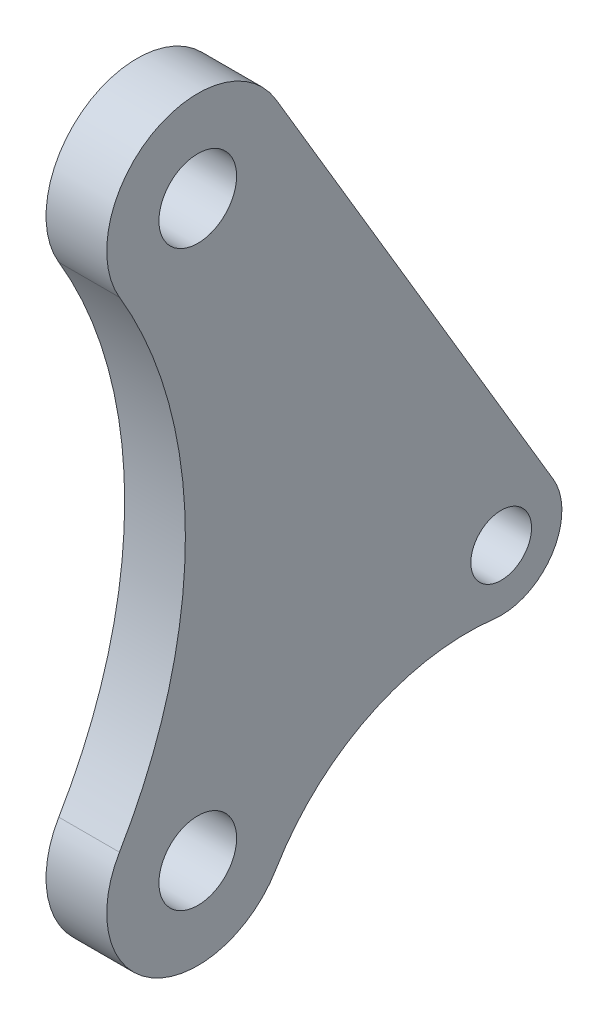
ISO-10303-21;
HEADER;
FILE_DESCRIPTION(('STEP AP214'),'2;1');
FILE_NAME('part.step','',(''),(''),'','','');
FILE_SCHEMA(('AUTOMOTIVE_DESIGN { 1 0 10303 214 1 1 1 1 }'));
ENDSEC;
DATA;
#1=APPLICATION_CONTEXT('core data for automotive mechanical design processes');
#2=APPLICATION_PROTOCOL_DEFINITION('international standard','automotive_design',2000,#1);
#3=PRODUCT_CONTEXT('',#1,'mechanical');
#4=PRODUCT('Part','Part','',(#3));
#5=PRODUCT_RELATED_PRODUCT_CATEGORY('part','',(#4));
#6=PRODUCT_DEFINITION_FORMATION('','',#4);
#7=PRODUCT_DEFINITION_CONTEXT('part definition',#1,'design');
#8=PRODUCT_DEFINITION('design','',#6,#7);
#9=PRODUCT_DEFINITION_SHAPE('','',#8);
#10=(LENGTH_UNIT() NAMED_UNIT(*) SI_UNIT(.MILLI.,.METRE.));
#11=(NAMED_UNIT(*) PLANE_ANGLE_UNIT() SI_UNIT($,.RADIAN.));
#12=(NAMED_UNIT(*) SI_UNIT($,.STERADIAN.) SOLID_ANGLE_UNIT());
#13=UNCERTAINTY_MEASURE_WITH_UNIT(LENGTH_MEASURE(1.E-05),#10,'distance_accuracy_value','');
#14=(GEOMETRIC_REPRESENTATION_CONTEXT(3) GLOBAL_UNCERTAINTY_ASSIGNED_CONTEXT((#13)) GLOBAL_UNIT_ASSIGNED_CONTEXT((#10,
#11,#12)) REPRESENTATION_CONTEXT('',''));
#15=CARTESIAN_POINT('',(0.,0.,0.));
#16=DIRECTION('',(0.,0.,1.));
#17=DIRECTION('',(1.,0.,0.));
#18=AXIS2_PLACEMENT_3D('',#15,#16,#17);
#19=CARTESIAN_POINT('',(3.175,-8.37624187138733,-14.1204117999572));
#20=DIRECTION('',(-1.,0.,0.));
#21=DIRECTION('',(0.,0.,1.));
#22=AXIS2_PLACEMENT_3D('',#19,#20,#21);
#23=CYLINDRICAL_SURFACE('',#22,11.6554005140229);
#24=CARTESIAN_POINT('',(0.,-8.37624187138733,-14.1204117999572));
#25=DIRECTION('',(-1.,0.,0.));
#26=DIRECTION('',(0.,0.,-1.));
#27=AXIS2_PLACEMENT_3D('',#24,#25,#26);
#28=CIRCLE('',#27,11.6554005140229);
#29=CARTESIAN_POINT('',(0.,-2.42977790481856,-4.09604511489504));
#30=VERTEX_POINT('',#29);
#31=CARTESIAN_POINT('',(0.,3.19729903973633,-15.4993649974343));
#32=VERTEX_POINT('',#31);
#33=EDGE_CURVE('E148',#30,#32,#28,.T.);
#34=ORIENTED_EDGE('',*,*,#33,.T.);
#35=DIRECTION('',(-1.,0.,0.));
#36=VECTOR('',#35,1.);
#37=CARTESIAN_POINT('',(3.175,3.19729903973633,-15.4993649974343));
#38=LINE('',#37,#36);
#39=CARTESIAN_POINT('',(3.175,3.19729903973633,-15.4993649974343));
#40=VERTEX_POINT('',#39);
#41=EDGE_CURVE('E11',#40,#32,#38,.T.);
#42=ORIENTED_EDGE('',*,*,#41,.F.);
#43=CARTESIAN_POINT('',(3.175,-8.37624187138733,-14.1204117999572));
#44=DIRECTION('',(-1.,0.,0.));
#45=DIRECTION('',(0.,0.,-1.));
#46=AXIS2_PLACEMENT_3D('',#43,#44,#45);
#47=CIRCLE('',#46,11.6554005140229);
#48=CARTESIAN_POINT('',(3.175,-2.42977790481856,-4.09604511489504));
#49=VERTEX_POINT('',#48);
#50=EDGE_CURVE('E165',#49,#40,#47,.T.);
#51=ORIENTED_EDGE('',*,*,#50,.F.);
#52=DIRECTION('',(-1.,0.,0.));
#53=VECTOR('',#52,1.);
#54=CARTESIAN_POINT('',(3.175,-2.42977790481856,-4.09604511489504));
#55=LINE('',#54,#53);
#56=EDGE_CURVE('E144',#49,#30,#55,.T.);
#57=ORIENTED_EDGE('',*,*,#56,.T.);
#58=EDGE_LOOP('',(#34,#42,#51,#57));
#59=FACE_BOUND('',#58,.T.);
#60=ADVANCED_FACE('F45',(#59),#23,.F.);
#61=CARTESIAN_POINT('',(3.175,6.35,-15.875));
#62=DIRECTION('',(-1.,0.,0.));
#63=DIRECTION('',(0.,0.,1.));
#64=AXIS2_PLACEMENT_3D('',#61,#62,#63);
#65=CYLINDRICAL_SURFACE('',#64,3.175);
#66=CARTESIAN_POINT('',(0.,6.35,-15.875));
#67=DIRECTION('',(1.,0.,0.));
#68=DIRECTION('',(0.,0.,1.));
#69=AXIS2_PLACEMENT_3D('',#66,#67,#68);
#70=CIRCLE('',#69,3.175);
#71=CARTESIAN_POINT('',(0.,7.96985193654571,-18.6056967432634));
#72=VERTEX_POINT('',#71);
#73=EDGE_CURVE('E152',#32,#72,#70,.T.);
#74=ORIENTED_EDGE('',*,*,#73,.T.);
#75=DIRECTION('',(-1.,0.,0.));
#76=VECTOR('',#75,1.);
#77=CARTESIAN_POINT('',(3.175,7.96985193654571,-18.6056967432634));
#78=LINE('',#77,#76);
#79=CARTESIAN_POINT('',(3.175,7.96985193654571,-18.6056967432634));
#80=VERTEX_POINT('',#79);
#81=EDGE_CURVE('E54',#80,#72,#78,.T.);
#82=ORIENTED_EDGE('',*,*,#81,.F.);
#83=CARTESIAN_POINT('',(3.175,6.35,-15.875));
#84=DIRECTION('',(1.,0.,0.));
#85=DIRECTION('',(0.,0.,1.));
#86=AXIS2_PLACEMENT_3D('',#83,#84,#85);
#87=CIRCLE('',#86,3.175);
#88=EDGE_CURVE('E109',#40,#80,#87,.T.);
#89=ORIENTED_EDGE('',*,*,#88,.F.);
#90=ORIENTED_EDGE('',*,*,#41,.T.);
#91=EDGE_LOOP('',(#74,#82,#89,#90));
#92=FACE_BOUND('',#91,.T.);
#93=ADVANCED_FACE('F195',(#92),#65,.T.);
#94=CARTESIAN_POINT('',(3.175,32.4297779048186,-4.09604511489505));
#95=DIRECTION('',(0.,-0.510189586313607,0.860061966382161));
#96=DIRECTION('',(0.,-0.860061966382161,-0.510189586313607));
#97=AXIS2_PLACEMENT_3D('',#94,#95,#96);
#98=PLANE('',#97);
#99=DIRECTION('',(0.,0.860061966382161,0.510189586313607));
#100=VECTOR('',#99,1.);
#101=CARTESIAN_POINT('',(0.,32.4297779048186,-4.09604511489505));
#102=LINE('',#101,#100);
#103=CARTESIAN_POINT('',(0.,32.4297779048186,-4.09604511489504));
#104=VERTEX_POINT('',#103);
#105=EDGE_CURVE('E156',#72,#104,#102,.T.);
#106=ORIENTED_EDGE('',*,*,#105,.T.);
#107=DIRECTION('',(-1.,0.,0.));
#108=VECTOR('',#107,1.);
#109=CARTESIAN_POINT('',(3.175,32.4297779048186,-4.09604511489504));
#110=LINE('',#109,#108);
#111=CARTESIAN_POINT('',(3.175,32.4297779048186,-4.09604511489504));
#112=VERTEX_POINT('',#111);
#113=EDGE_CURVE('E135',#112,#104,#110,.T.);
#114=ORIENTED_EDGE('',*,*,#113,.F.);
#115=DIRECTION('',(0.,0.860061966382161,0.510189586313607));
#116=VECTOR('',#115,1.);
#117=CARTESIAN_POINT('',(3.175,32.4297779048186,-4.09604511489505));
#118=LINE('',#117,#116);
#119=EDGE_CURVE('E124',#80,#112,#118,.T.);
#120=ORIENTED_EDGE('',*,*,#119,.F.);
#121=ORIENTED_EDGE('',*,*,#81,.T.);
#122=EDGE_LOOP('',(#106,#114,#120,#121));
#123=FACE_BOUND('',#122,.T.);
#124=ADVANCED_FACE('F176',(#123),#98,.F.);
#125=CARTESIAN_POINT('',(3.175,30.,0.));
#126=DIRECTION('',(-1.,0.,0.));
#127=DIRECTION('',(0.,0.,1.));
#128=AXIS2_PLACEMENT_3D('',#125,#126,#127);
#129=CYLINDRICAL_SURFACE('',#128,4.7625);
#130=CARTESIAN_POINT('',(0.,30.,0.));
#131=DIRECTION('',(1.,0.,0.));
#132=DIRECTION('',(0.,0.,1.));
#133=AXIS2_PLACEMENT_3D('',#130,#131,#132);
#134=CIRCLE('',#133,4.7625);
#135=CARTESIAN_POINT('',(0.,27.5702220951814,4.09604511489504));
#136=VERTEX_POINT('',#135);
#137=EDGE_CURVE('E133',#104,#136,#134,.T.);
#138=ORIENTED_EDGE('',*,*,#137,.T.);
#139=DIRECTION('',(-1.,0.,0.));
#140=VECTOR('',#139,1.);
#141=CARTESIAN_POINT('',(3.175,27.5702220951814,4.09604511489504));
#142=LINE('',#141,#140);
#143=CARTESIAN_POINT('',(3.175,27.5702220951814,4.09604511489504));
#144=VERTEX_POINT('',#143);
#145=EDGE_CURVE('E130',#144,#136,#142,.T.);
#146=ORIENTED_EDGE('',*,*,#145,.F.);
#147=CARTESIAN_POINT('',(3.175,30.,0.));
#148=DIRECTION('',(1.,0.,0.));
#149=DIRECTION('',(0.,0.,1.));
#150=AXIS2_PLACEMENT_3D('',#147,#148,#149);
#151=CIRCLE('',#150,4.7625);
#152=EDGE_CURVE('E118',#112,#144,#151,.T.);
#153=ORIENTED_EDGE('',*,*,#152,.F.);
#154=ORIENTED_EDGE('',*,*,#113,.T.);
#155=EDGE_LOOP('',(#138,#146,#153,#154));
#156=FACE_BOUND('',#155,.T.);
#157=ADVANCED_FACE('F131',(#156),#129,.T.);
#158=CARTESIAN_POINT('',(3.175,15.,25.2865402231129));
#159=DIRECTION('',(-1.,0.,0.));
#160=DIRECTION('',(0.,0.,1.));
#161=AXIS2_PLACEMENT_3D('',#158,#159,#160);
#162=CYLINDRICAL_SURFACE('',#161,24.6383353019962);
#163=CARTESIAN_POINT('',(0.,15.,25.2865402231129));
#164=DIRECTION('',(-1.,0.,0.));
#165=DIRECTION('',(0.,0.,1.));
#166=AXIS2_PLACEMENT_3D('',#163,#164,#165);
#167=CIRCLE('',#166,24.6383353019962);
#168=CARTESIAN_POINT('',(0.,2.42977790481856,4.09604511489504));
#169=VERTEX_POINT('',#168);
#170=EDGE_CURVE('E93',#136,#169,#167,.T.);
#171=ORIENTED_EDGE('',*,*,#170,.T.);
#172=DIRECTION('',(-1.,0.,0.));
#173=VECTOR('',#172,1.);
#174=CARTESIAN_POINT('',(3.175,2.42977790481856,4.09604511489504));
#175=LINE('',#174,#173);
#176=CARTESIAN_POINT('',(3.175,2.42977790481856,4.09604511489504));
#177=VERTEX_POINT('',#176);
#178=EDGE_CURVE('E136',#177,#169,#175,.T.);
#179=ORIENTED_EDGE('',*,*,#178,.F.);
#180=CARTESIAN_POINT('',(3.175,15.,25.2865402231129));
#181=DIRECTION('',(-1.,0.,0.));
#182=DIRECTION('',(0.,0.,1.));
#183=AXIS2_PLACEMENT_3D('',#180,#181,#182);
#184=CIRCLE('',#183,24.6383353019962);
#185=EDGE_CURVE('E122',#144,#177,#184,.T.);
#186=ORIENTED_EDGE('',*,*,#185,.F.);
#187=ORIENTED_EDGE('',*,*,#145,.T.);
#188=EDGE_LOOP('',(#171,#179,#186,#187));
#189=FACE_BOUND('',#188,.T.);
#190=ADVANCED_FACE('F138',(#189),#162,.F.);
#191=CARTESIAN_POINT('',(3.175,0.,0.));
#192=DIRECTION('',(-1.,0.,0.));
#193=DIRECTION('',(0.,0.,1.));
#194=AXIS2_PLACEMENT_3D('',#191,#192,#193);
#195=CYLINDRICAL_SURFACE('',#194,4.7625);
#196=CARTESIAN_POINT('',(0.,0.,0.));
#197=DIRECTION('',(1.,0.,0.));
#198=DIRECTION('',(0.,0.,1.));
#199=AXIS2_PLACEMENT_3D('',#196,#197,#198);
#200=CIRCLE('',#199,4.7625);
#201=EDGE_CURVE('E99',#169,#30,#200,.T.);
#202=ORIENTED_EDGE('',*,*,#201,.T.);
#203=ORIENTED_EDGE('',*,*,#56,.F.);
#204=CARTESIAN_POINT('',(3.175,0.,0.));
#205=DIRECTION('',(1.,0.,0.));
#206=DIRECTION('',(0.,0.,1.));
#207=AXIS2_PLACEMENT_3D('',#204,#205,#206);
#208=CIRCLE('',#207,4.7625);
#209=EDGE_CURVE('E65',#177,#49,#208,.T.);
#210=ORIENTED_EDGE('',*,*,#209,.F.);
#211=ORIENTED_EDGE('',*,*,#178,.T.);
#212=EDGE_LOOP('',(#202,#203,#210,#211));
#213=FACE_BOUND('',#212,.T.);
#214=ADVANCED_FACE('F183',(#213),#195,.T.);
#215=CARTESIAN_POINT('',(3.175,-8.37624187138733,-14.1204117999572));
#216=DIRECTION('',(1.,0.,0.));
#217=DIRECTION('',(0.,0.,-1.));
#218=AXIS2_PLACEMENT_3D('',#215,#216,#217);
#219=PLANE('',#218);
#220=CARTESIAN_POINT('',(3.175,30.,0.));
#221=DIRECTION('',(1.,0.,0.));
#222=DIRECTION('',(0.,0.,-1.));
#223=AXIS2_PLACEMENT_3D('',#220,#221,#222);
#224=CIRCLE('',#223,2.032);
#225=CARTESIAN_POINT('',(3.175,30.,-2.032));
#226=VERTEX_POINT('',#225);
#227=EDGE_CURVE('E291',#226,#226,#224,.T.);
#228=ORIENTED_EDGE('',*,*,#227,.F.);
#229=EDGE_LOOP('',(#228));
#230=FACE_BOUND('',#229,.T.);
#231=CARTESIAN_POINT('',(3.175,0.,0.));
#232=DIRECTION('',(1.,0.,0.));
#233=DIRECTION('',(0.,0.,-1.));
#234=AXIS2_PLACEMENT_3D('',#231,#232,#233);
#235=CIRCLE('',#234,2.032);
#236=CARTESIAN_POINT('',(3.175,0.,-2.032));
#237=VERTEX_POINT('',#236);
#238=EDGE_CURVE('E293',#237,#237,#235,.T.);
#239=ORIENTED_EDGE('',*,*,#238,.F.);
#240=EDGE_LOOP('',(#239));
#241=FACE_BOUND('',#240,.T.);
#242=CARTESIAN_POINT('',(3.175,6.35,-15.875));
#243=DIRECTION('',(1.,0.,0.));
#244=DIRECTION('',(0.,0.,-1.));
#245=AXIS2_PLACEMENT_3D('',#242,#243,#244);
#246=CIRCLE('',#245,1.5875);
#247=CARTESIAN_POINT('',(3.175,6.35,-17.4625));
#248=VERTEX_POINT('',#247);
#249=EDGE_CURVE('E304',#248,#248,#246,.T.);
#250=ORIENTED_EDGE('',*,*,#249,.F.);
#251=EDGE_LOOP('',(#250));
#252=FACE_BOUND('',#251,.T.);
#253=ORIENTED_EDGE('',*,*,#50,.T.);
#254=ORIENTED_EDGE('',*,*,#88,.T.);
#255=ORIENTED_EDGE('',*,*,#119,.T.);
#256=ORIENTED_EDGE('',*,*,#152,.T.);
#257=ORIENTED_EDGE('',*,*,#185,.T.);
#258=ORIENTED_EDGE('',*,*,#209,.T.);
#259=EDGE_LOOP('',(#253,#254,#255,#256,#257,#258));
#260=FACE_BOUND('',#259,.T.);
#261=ADVANCED_FACE('F120',(#230,#241,#252,#260),#219,.T.);
#262=CARTESIAN_POINT('',(0.,-8.37624187138733,-14.1204117999572));
#263=DIRECTION('',(1.,0.,0.));
#264=DIRECTION('',(0.,0.,-1.));
#265=AXIS2_PLACEMENT_3D('',#262,#263,#264);
#266=PLANE('',#265);
#267=CARTESIAN_POINT('',(0.,30.,0.));
#268=DIRECTION('',(1.,0.,0.));
#269=DIRECTION('',(0.,0.,-1.));
#270=AXIS2_PLACEMENT_3D('',#267,#268,#269);
#271=CIRCLE('',#270,2.032);
#272=CARTESIAN_POINT('',(0.,30.,-2.032));
#273=VERTEX_POINT('',#272);
#274=EDGE_CURVE('E153',#273,#273,#271,.T.);
#275=ORIENTED_EDGE('',*,*,#274,.T.);
#276=EDGE_LOOP('',(#275));
#277=FACE_BOUND('',#276,.T.);
#278=CARTESIAN_POINT('',(0.,0.,0.));
#279=DIRECTION('',(1.,0.,0.));
#280=DIRECTION('',(0.,0.,-1.));
#281=AXIS2_PLACEMENT_3D('',#278,#279,#280);
#282=CIRCLE('',#281,2.032);
#283=CARTESIAN_POINT('',(0.,0.,-2.032));
#284=VERTEX_POINT('',#283);
#285=EDGE_CURVE('E298',#284,#284,#282,.T.);
#286=ORIENTED_EDGE('',*,*,#285,.T.);
#287=EDGE_LOOP('',(#286));
#288=FACE_BOUND('',#287,.T.);
#289=CARTESIAN_POINT('',(0.,6.35,-15.875));
#290=DIRECTION('',(1.,0.,0.));
#291=DIRECTION('',(0.,0.,-1.));
#292=AXIS2_PLACEMENT_3D('',#289,#290,#291);
#293=CIRCLE('',#292,1.5875);
#294=CARTESIAN_POINT('',(0.,6.35,-17.4625));
#295=VERTEX_POINT('',#294);
#296=EDGE_CURVE('E307',#295,#295,#293,.T.);
#297=ORIENTED_EDGE('',*,*,#296,.T.);
#298=EDGE_LOOP('',(#297));
#299=FACE_BOUND('',#298,.T.);
#300=ORIENTED_EDGE('',*,*,#33,.F.);
#301=ORIENTED_EDGE('',*,*,#201,.F.);
#302=ORIENTED_EDGE('',*,*,#170,.F.);
#303=ORIENTED_EDGE('',*,*,#137,.F.);
#304=ORIENTED_EDGE('',*,*,#105,.F.);
#305=ORIENTED_EDGE('',*,*,#73,.F.);
#306=EDGE_LOOP('',(#300,#301,#302,#303,#304,#305));
#307=FACE_BOUND('',#306,.T.);
#308=ADVANCED_FACE('F179',(#277,#288,#299,#307),#266,.F.);
#309=CARTESIAN_POINT('',(0.,6.35,-15.875));
#310=DIRECTION('',(1.,0.,0.));
#311=DIRECTION('',(0.,0.,-1.));
#312=AXIS2_PLACEMENT_3D('',#309,#310,#311);
#313=CYLINDRICAL_SURFACE('',#312,1.5875);
#314=ORIENTED_EDGE('',*,*,#296,.F.);
#315=EDGE_LOOP('',(#314));
#316=FACE_BOUND('',#315,.T.);
#317=ORIENTED_EDGE('',*,*,#249,.T.);
#318=EDGE_LOOP('',(#317));
#319=FACE_BOUND('',#318,.T.);
#320=ADVANCED_FACE('F232',(#316,#319),#313,.F.);
#321=CARTESIAN_POINT('',(0.,0.,0.));
#322=DIRECTION('',(1.,0.,0.));
#323=DIRECTION('',(0.,0.,-1.));
#324=AXIS2_PLACEMENT_3D('',#321,#322,#323);
#325=CYLINDRICAL_SURFACE('',#324,2.032);
#326=ORIENTED_EDGE('',*,*,#285,.F.);
#327=EDGE_LOOP('',(#326));
#328=FACE_BOUND('',#327,.T.);
#329=ORIENTED_EDGE('',*,*,#238,.T.);
#330=EDGE_LOOP('',(#329));
#331=FACE_BOUND('',#330,.T.);
#332=ADVANCED_FACE('F240',(#328,#331),#325,.F.);
#333=CARTESIAN_POINT('',(0.,30.,0.));
#334=DIRECTION('',(1.,0.,0.));
#335=DIRECTION('',(0.,0.,-1.));
#336=AXIS2_PLACEMENT_3D('',#333,#334,#335);
#337=CYLINDRICAL_SURFACE('',#336,2.032);
#338=ORIENTED_EDGE('',*,*,#274,.F.);
#339=EDGE_LOOP('',(#338));
#340=FACE_BOUND('',#339,.T.);
#341=ORIENTED_EDGE('',*,*,#227,.T.);
#342=EDGE_LOOP('',(#341));
#343=FACE_BOUND('',#342,.T.);
#344=ADVANCED_FACE('F249',(#340,#343),#337,.F.);
#345=CLOSED_SHELL('',(#60,#93,#124,#157,#190,#214,#261,#308,#320,#332,#344));
#346=MANIFOLD_SOLID_BREP('B2',#345);
#347=ADVANCED_BREP_SHAPE_REPRESENTATION('',(#18,#346),#14);
#348=SHAPE_DEFINITION_REPRESENTATION(#9,#347);
ENDSEC;
END-ISO-10303-21;
